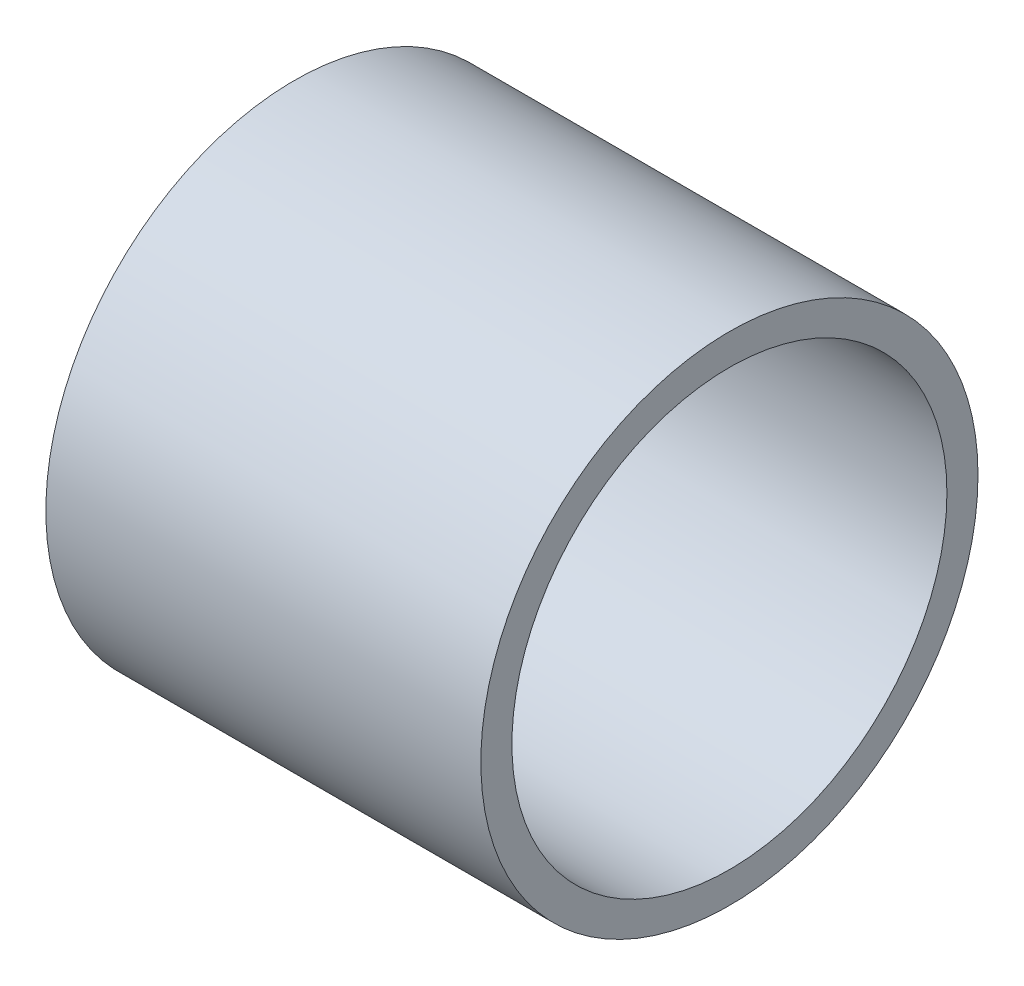
ISO-10303-21;
HEADER;
FILE_DESCRIPTION(('STEP AP214'),'2;1');
FILE_NAME('part.step','',(''),(''),'','','');
FILE_SCHEMA(('AUTOMOTIVE_DESIGN { 1 0 10303 214 1 1 1 1 }'));
ENDSEC;
DATA;
#1=APPLICATION_CONTEXT('core data for automotive mechanical design processes');
#2=APPLICATION_PROTOCOL_DEFINITION('international standard','automotive_design',2000,#1);
#3=PRODUCT_CONTEXT('',#1,'mechanical');
#4=PRODUCT('Part','Part','',(#3));
#5=PRODUCT_RELATED_PRODUCT_CATEGORY('part','',(#4));
#6=PRODUCT_DEFINITION_FORMATION('','',#4);
#7=PRODUCT_DEFINITION_CONTEXT('part definition',#1,'design');
#8=PRODUCT_DEFINITION('design','',#6,#7);
#9=PRODUCT_DEFINITION_SHAPE('','',#8);
#10=(LENGTH_UNIT() NAMED_UNIT(*) SI_UNIT(.MILLI.,.METRE.));
#11=(NAMED_UNIT(*) PLANE_ANGLE_UNIT() SI_UNIT($,.RADIAN.));
#12=(NAMED_UNIT(*) SI_UNIT($,.STERADIAN.) SOLID_ANGLE_UNIT());
#13=UNCERTAINTY_MEASURE_WITH_UNIT(LENGTH_MEASURE(1.E-05),#10,'distance_accuracy_value','');
#14=(GEOMETRIC_REPRESENTATION_CONTEXT(3) GLOBAL_UNCERTAINTY_ASSIGNED_CONTEXT((#13)) GLOBAL_UNIT_ASSIGNED_CONTEXT((#10,
#11,#12)) REPRESENTATION_CONTEXT('',''));
#15=CARTESIAN_POINT('',(0.,0.,0.));
#16=DIRECTION('',(0.,0.,1.));
#17=DIRECTION('',(1.,0.,0.));
#18=AXIS2_PLACEMENT_3D('',#15,#16,#17);
#19=CARTESIAN_POINT('',(28.,0.,0.));
#20=DIRECTION('',(1.,0.,0.));
#21=DIRECTION('',(0.,0.,-1.));
#22=AXIS2_PLACEMENT_3D('',#19,#20,#21);
#23=PLANE('',#22);
#24=CARTESIAN_POINT('',(28.,0.,0.));
#25=DIRECTION('',(1.,0.,0.));
#26=DIRECTION('',(0.,0.,-1.));
#27=AXIS2_PLACEMENT_3D('',#24,#25,#26);
#28=CIRCLE('',#27,16.);
#29=CARTESIAN_POINT('',(28.,0.,-16.));
#30=VERTEX_POINT('',#29);
#31=EDGE_CURVE('E38',#30,#30,#28,.T.);
#32=ORIENTED_EDGE('',*,*,#31,.T.);
#33=EDGE_LOOP('',(#32));
#34=FACE_BOUND('',#33,.T.);
#35=CARTESIAN_POINT('',(28.,0.,0.));
#36=DIRECTION('',(1.,0.,0.));
#37=DIRECTION('',(0.,0.,-1.));
#38=AXIS2_PLACEMENT_3D('',#35,#36,#37);
#39=CIRCLE('',#38,14.);
#40=CARTESIAN_POINT('',(28.,0.,-14.));
#41=VERTEX_POINT('',#40);
#42=EDGE_CURVE('E47',#41,#41,#39,.T.);
#43=ORIENTED_EDGE('',*,*,#42,.F.);
#44=EDGE_LOOP('',(#43));
#45=FACE_BOUND('',#44,.T.);
#46=ADVANCED_FACE('F31',(#34,#45),#23,.T.);
#47=CARTESIAN_POINT('',(0.,0.,0.));
#48=DIRECTION('',(1.,0.,0.));
#49=DIRECTION('',(0.,0.,-1.));
#50=AXIS2_PLACEMENT_3D('',#47,#48,#49);
#51=PLANE('',#50);
#52=CARTESIAN_POINT('',(0.,0.,0.));
#53=DIRECTION('',(1.,0.,0.));
#54=DIRECTION('',(0.,0.,-1.));
#55=AXIS2_PLACEMENT_3D('',#52,#53,#54);
#56=CIRCLE('',#55,16.);
#57=CARTESIAN_POINT('',(0.,0.,-16.));
#58=VERTEX_POINT('',#57);
#59=EDGE_CURVE('E42',#58,#58,#56,.T.);
#60=ORIENTED_EDGE('',*,*,#59,.F.);
#61=EDGE_LOOP('',(#60));
#62=FACE_BOUND('',#61,.T.);
#63=CARTESIAN_POINT('',(0.,0.,0.));
#64=DIRECTION('',(1.,0.,0.));
#65=DIRECTION('',(0.,0.,-1.));
#66=AXIS2_PLACEMENT_3D('',#63,#64,#65);
#67=CIRCLE('',#66,9.);
#68=CARTESIAN_POINT('',(0.,0.,-9.));
#69=VERTEX_POINT('',#68);
#70=EDGE_CURVE('E52',#69,#69,#67,.T.);
#71=ORIENTED_EDGE('',*,*,#70,.T.);
#72=EDGE_LOOP('',(#71));
#73=FACE_BOUND('',#72,.T.);
#74=ADVANCED_FACE('F73',(#62,#73),#51,.F.);
#75=CARTESIAN_POINT('',(28.,0.,0.));
#76=DIRECTION('',(-1.,0.,0.));
#77=DIRECTION('',(0.,0.,1.));
#78=AXIS2_PLACEMENT_3D('',#75,#76,#77);
#79=CYLINDRICAL_SURFACE('',#78,16.);
#80=ORIENTED_EDGE('',*,*,#31,.F.);
#81=EDGE_LOOP('',(#80));
#82=FACE_BOUND('',#81,.T.);
#83=ORIENTED_EDGE('',*,*,#59,.T.);
#84=EDGE_LOOP('',(#83));
#85=FACE_BOUND('',#84,.T.);
#86=ADVANCED_FACE('F33',(#82,#85),#79,.T.);
#87=CARTESIAN_POINT('',(28.,0.,0.));
#88=DIRECTION('',(-1.,0.,0.));
#89=DIRECTION('',(0.,0.,1.));
#90=AXIS2_PLACEMENT_3D('',#87,#88,#89);
#91=CYLINDRICAL_SURFACE('',#90,14.);
#92=CARTESIAN_POINT('',(2.,0.,0.));
#93=DIRECTION('',(1.,0.,0.));
#94=DIRECTION('',(0.,0.,-1.));
#95=AXIS2_PLACEMENT_3D('',#92,#93,#94);
#96=CIRCLE('',#95,14.);
#97=CARTESIAN_POINT('',(2.,0.,-14.));
#98=VERTEX_POINT('',#97);
#99=EDGE_CURVE('E10',#98,#98,#96,.T.);
#100=ORIENTED_EDGE('',*,*,#99,.F.);
#101=EDGE_LOOP('',(#100));
#102=FACE_BOUND('',#101,.T.);
#103=ORIENTED_EDGE('',*,*,#42,.T.);
#104=EDGE_LOOP('',(#103));
#105=FACE_BOUND('',#104,.T.);
#106=ADVANCED_FACE('F63',(#102,#105),#91,.F.);
#107=CARTESIAN_POINT('',(2.,0.,0.));
#108=DIRECTION('',(1.,0.,0.));
#109=DIRECTION('',(0.,0.,-1.));
#110=AXIS2_PLACEMENT_3D('',#107,#108,#109);
#111=PLANE('',#110);
#112=ORIENTED_EDGE('',*,*,#99,.T.);
#113=EDGE_LOOP('',(#112));
#114=FACE_BOUND('',#113,.T.);
#115=CARTESIAN_POINT('',(2.,0.,0.));
#116=DIRECTION('',(1.,0.,0.));
#117=DIRECTION('',(0.,0.,-1.));
#118=AXIS2_PLACEMENT_3D('',#115,#116,#117);
#119=CIRCLE('',#118,9.);
#120=CARTESIAN_POINT('',(2.,0.,-9.));
#121=VERTEX_POINT('',#120);
#122=EDGE_CURVE('E51',#121,#121,#119,.T.);
#123=ORIENTED_EDGE('',*,*,#122,.F.);
#124=EDGE_LOOP('',(#123));
#125=FACE_BOUND('',#124,.T.);
#126=ADVANCED_FACE('F61',(#114,#125),#111,.T.);
#127=CARTESIAN_POINT('',(2.,0.,0.));
#128=DIRECTION('',(-1.,0.,0.));
#129=DIRECTION('',(0.,0.,1.));
#130=AXIS2_PLACEMENT_3D('',#127,#128,#129);
#131=CYLINDRICAL_SURFACE('',#130,9.);
#132=ORIENTED_EDGE('',*,*,#122,.T.);
#133=EDGE_LOOP('',(#132));
#134=FACE_BOUND('',#133,.T.);
#135=ORIENTED_EDGE('',*,*,#70,.F.);
#136=EDGE_LOOP('',(#135));
#137=FACE_BOUND('',#136,.T.);
#138=ADVANCED_FACE('F58',(#134,#137),#131,.F.);
#139=CLOSED_SHELL('',(#46,#74,#86,#106,#126,#138));
#140=MANIFOLD_SOLID_BREP('B2',#139);
#141=ADVANCED_BREP_SHAPE_REPRESENTATION('',(#18,#140),#14);
#142=SHAPE_DEFINITION_REPRESENTATION(#9,#141);
ENDSEC;
END-ISO-10303-21;
